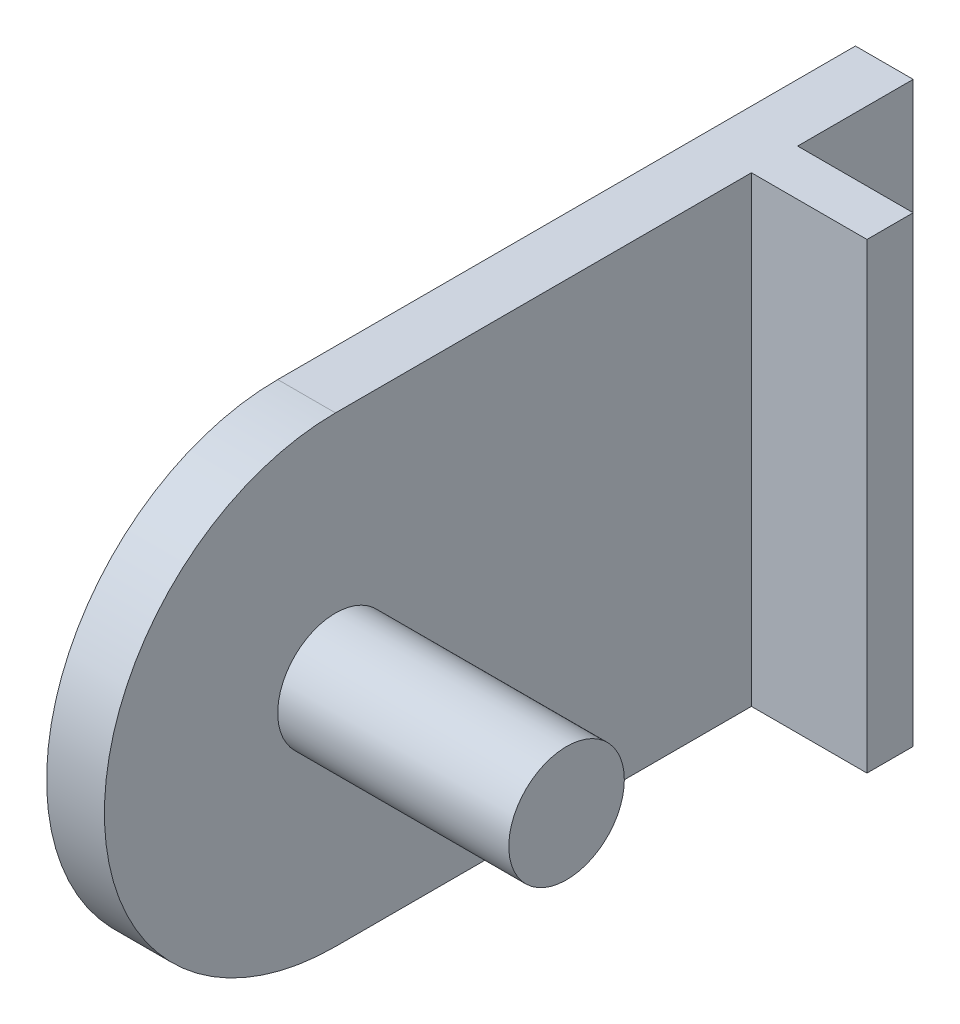
ISO-10303-21;
HEADER;
FILE_DESCRIPTION(('STEP AP214'),'2;1');
FILE_NAME('part.step','',(''),(''),'','','');
FILE_SCHEMA(('AUTOMOTIVE_DESIGN { 1 0 10303 214 1 1 1 1 }'));
ENDSEC;
DATA;
#1=APPLICATION_CONTEXT('core data for automotive mechanical design processes');
#2=APPLICATION_PROTOCOL_DEFINITION('international standard','automotive_design',2000,#1);
#3=PRODUCT_CONTEXT('',#1,'mechanical');
#4=PRODUCT('Part','Part','',(#3));
#5=PRODUCT_RELATED_PRODUCT_CATEGORY('part','',(#4));
#6=PRODUCT_DEFINITION_FORMATION('','',#4);
#7=PRODUCT_DEFINITION_CONTEXT('part definition',#1,'design');
#8=PRODUCT_DEFINITION('design','',#6,#7);
#9=PRODUCT_DEFINITION_SHAPE('','',#8);
#10=(LENGTH_UNIT() NAMED_UNIT(*) SI_UNIT(.MILLI.,.METRE.));
#11=(NAMED_UNIT(*) PLANE_ANGLE_UNIT() SI_UNIT($,.RADIAN.));
#12=(NAMED_UNIT(*) SI_UNIT($,.STERADIAN.) SOLID_ANGLE_UNIT());
#13=UNCERTAINTY_MEASURE_WITH_UNIT(LENGTH_MEASURE(1.E-05),#10,'distance_accuracy_value','');
#14=(GEOMETRIC_REPRESENTATION_CONTEXT(3) GLOBAL_UNCERTAINTY_ASSIGNED_CONTEXT((#13)) GLOBAL_UNIT_ASSIGNED_CONTEXT((#10,
#11,#12)) REPRESENTATION_CONTEXT('',''));
#15=CARTESIAN_POINT('',(0.,0.,0.));
#16=DIRECTION('',(0.,0.,1.));
#17=DIRECTION('',(1.,0.,0.));
#18=AXIS2_PLACEMENT_3D('',#15,#16,#17);
#19=CARTESIAN_POINT('',(5.,0.,0.));
#20=DIRECTION('',(1.,0.,0.));
#21=DIRECTION('',(0.,0.,-1.));
#22=AXIS2_PLACEMENT_3D('',#19,#20,#21);
#23=PLANE('',#22);
#24=CARTESIAN_POINT('',(5.,0.,0.));
#25=DIRECTION('',(1.,0.,0.));
#26=DIRECTION('',(0.,0.,-1.));
#27=AXIS2_PLACEMENT_3D('',#24,#25,#26);
#28=CIRCLE('',#27,5.);
#29=CARTESIAN_POINT('',(5.,0.,-5.));
#30=VERTEX_POINT('',#29);
#31=EDGE_CURVE('E132',#30,#30,#28,.T.);
#32=ORIENTED_EDGE('',*,*,#31,.F.);
#33=EDGE_LOOP('',(#32));
#34=FACE_BOUND('',#33,.T.);
#35=DIRECTION('',(0.,0.,-1.));
#36=VECTOR('',#35,1.);
#37=CARTESIAN_POINT('',(5.,-20.,0.));
#38=LINE('',#37,#36);
#39=CARTESIAN_POINT('',(5.,-20.,0.));
#40=VERTEX_POINT('',#39);
#41=CARTESIAN_POINT('',(5.,-20.,-36.));
#42=VERTEX_POINT('',#41);
#43=EDGE_CURVE('E145',#40,#42,#38,.T.);
#44=ORIENTED_EDGE('',*,*,#43,.T.);
#45=DIRECTION('',(0.,1.,0.));
#46=VECTOR('',#45,1.);
#47=CARTESIAN_POINT('',(5.,-20.,-36.));
#48=LINE('',#47,#46);
#49=CARTESIAN_POINT('',(5.,20.,-36.));
#50=VERTEX_POINT('',#49);
#51=EDGE_CURVE('E54',#42,#50,#48,.T.);
#52=ORIENTED_EDGE('',*,*,#51,.T.);
#53=DIRECTION('',(0.,0.,1.));
#54=VECTOR('',#53,1.);
#55=CARTESIAN_POINT('',(5.,20.,0.));
#56=LINE('',#55,#54);
#57=CARTESIAN_POINT('',(5.,20.,0.));
#58=VERTEX_POINT('',#57);
#59=EDGE_CURVE('E121',#50,#58,#56,.T.);
#60=ORIENTED_EDGE('',*,*,#59,.T.);
#61=CARTESIAN_POINT('',(5.,0.,0.));
#62=DIRECTION('',(1.,0.,0.));
#63=DIRECTION('',(0.,0.,-1.));
#64=AXIS2_PLACEMENT_3D('',#61,#62,#63);
#65=CIRCLE('',#64,20.);
#66=EDGE_CURVE('E152',#58,#40,#65,.T.);
#67=ORIENTED_EDGE('',*,*,#66,.T.);
#68=EDGE_LOOP('',(#44,#52,#60,#67));
#69=FACE_BOUND('',#68,.T.);
#70=ADVANCED_FACE('F39',(#34,#69),#23,.T.);
#71=CARTESIAN_POINT('',(5.,-20.,0.));
#72=DIRECTION('',(0.,1.,0.));
#73=DIRECTION('',(0.,0.,1.));
#74=AXIS2_PLACEMENT_3D('',#71,#72,#73);
#75=PLANE('',#74);
#76=DIRECTION('',(0.,0.,-1.));
#77=VECTOR('',#76,1.);
#78=CARTESIAN_POINT('',(0.,-20.,0.));
#79=LINE('',#78,#77);
#80=CARTESIAN_POINT('',(0.,-20.,0.));
#81=VERTEX_POINT('',#80);
#82=CARTESIAN_POINT('',(0.,-20.,-50.));
#83=VERTEX_POINT('',#82);
#84=EDGE_CURVE('E140',#81,#83,#79,.T.);
#85=ORIENTED_EDGE('',*,*,#84,.T.);
#86=DIRECTION('',(-1.,0.,0.));
#87=VECTOR('',#86,1.);
#88=CARTESIAN_POINT('',(5.,-20.,-50.));
#89=LINE('',#88,#87);
#90=CARTESIAN_POINT('',(5.,-20.,-50.));
#91=VERTEX_POINT('',#90);
#92=EDGE_CURVE('E11',#91,#83,#89,.T.);
#93=ORIENTED_EDGE('',*,*,#92,.F.);
#94=CARTESIAN_POINT('',(5.,-20.,-40.));
#95=VERTEX_POINT('',#94);
#96=EDGE_CURVE('E148',#95,#91,#38,.T.);
#97=ORIENTED_EDGE('',*,*,#96,.F.);
#98=DIRECTION('',(-1.,0.,0.));
#99=VECTOR('',#98,1.);
#100=CARTESIAN_POINT('',(15.,-20.,-40.));
#101=LINE('',#100,#99);
#102=CARTESIAN_POINT('',(15.,-20.,-40.));
#103=VERTEX_POINT('',#102);
#104=EDGE_CURVE('E141',#103,#95,#101,.T.);
#105=ORIENTED_EDGE('',*,*,#104,.F.);
#106=DIRECTION('',(0.,0.,1.));
#107=VECTOR('',#106,1.);
#108=CARTESIAN_POINT('',(15.,-20.,-40.));
#109=LINE('',#108,#107);
#110=CARTESIAN_POINT('',(15.,-20.,-36.));
#111=VERTEX_POINT('',#110);
#112=EDGE_CURVE('E124',#103,#111,#109,.T.);
#113=ORIENTED_EDGE('',*,*,#112,.T.);
#114=DIRECTION('',(-1.,0.,0.));
#115=VECTOR('',#114,1.);
#116=CARTESIAN_POINT('',(15.,-20.,-36.));
#117=LINE('',#116,#115);
#118=EDGE_CURVE('E128',#111,#42,#117,.T.);
#119=ORIENTED_EDGE('',*,*,#118,.T.);
#120=ORIENTED_EDGE('',*,*,#43,.F.);
#121=DIRECTION('',(-1.,0.,0.));
#122=VECTOR('',#121,1.);
#123=CARTESIAN_POINT('',(5.,-20.,0.));
#124=LINE('',#123,#122);
#125=EDGE_CURVE('E154',#40,#81,#124,.T.);
#126=ORIENTED_EDGE('',*,*,#125,.T.);
#127=EDGE_LOOP('',(#85,#93,#97,#105,#113,#119,#120,#126));
#128=FACE_BOUND('',#127,.T.);
#129=ADVANCED_FACE('F41',(#128),#75,.F.);
#130=CARTESIAN_POINT('',(5.,20.,-50.));
#131=DIRECTION('',(0.,0.,1.));
#132=DIRECTION('',(0.,-1.,0.));
#133=AXIS2_PLACEMENT_3D('',#130,#131,#132);
#134=PLANE('',#133);
#135=DIRECTION('',(0.,1.,0.));
#136=VECTOR('',#135,1.);
#137=CARTESIAN_POINT('',(0.,20.,-50.));
#138=LINE('',#137,#136);
#139=CARTESIAN_POINT('',(0.,20.,-50.));
#140=VERTEX_POINT('',#139);
#141=EDGE_CURVE('E157',#83,#140,#138,.T.);
#142=ORIENTED_EDGE('',*,*,#141,.T.);
#143=DIRECTION('',(-1.,0.,0.));
#144=VECTOR('',#143,1.);
#145=CARTESIAN_POINT('',(5.,20.,-50.));
#146=LINE('',#145,#144);
#147=CARTESIAN_POINT('',(5.,20.,-50.));
#148=VERTEX_POINT('',#147);
#149=EDGE_CURVE('E47',#148,#140,#146,.T.);
#150=ORIENTED_EDGE('',*,*,#149,.F.);
#151=DIRECTION('',(0.,1.,0.));
#152=VECTOR('',#151,1.);
#153=CARTESIAN_POINT('',(5.,20.,-50.));
#154=LINE('',#153,#152);
#155=EDGE_CURVE('E147',#91,#148,#154,.T.);
#156=ORIENTED_EDGE('',*,*,#155,.F.);
#157=ORIENTED_EDGE('',*,*,#92,.T.);
#158=EDGE_LOOP('',(#142,#150,#156,#157));
#159=FACE_BOUND('',#158,.T.);
#160=ADVANCED_FACE('F193',(#159),#134,.F.);
#161=CARTESIAN_POINT('',(5.,20.,0.));
#162=DIRECTION('',(0.,-1.,0.));
#163=DIRECTION('',(0.,0.,-1.));
#164=AXIS2_PLACEMENT_3D('',#161,#162,#163);
#165=PLANE('',#164);
#166=DIRECTION('',(0.,0.,1.));
#167=VECTOR('',#166,1.);
#168=CARTESIAN_POINT('',(0.,20.,0.));
#169=LINE('',#168,#167);
#170=CARTESIAN_POINT('',(0.,20.,0.));
#171=VERTEX_POINT('',#170);
#172=EDGE_CURVE('E159',#140,#171,#169,.T.);
#173=ORIENTED_EDGE('',*,*,#172,.T.);
#174=DIRECTION('',(-1.,0.,0.));
#175=VECTOR('',#174,1.);
#176=CARTESIAN_POINT('',(5.,20.,0.));
#177=LINE('',#176,#175);
#178=EDGE_CURVE('E165',#58,#171,#177,.T.);
#179=ORIENTED_EDGE('',*,*,#178,.F.);
#180=ORIENTED_EDGE('',*,*,#59,.F.);
#181=DIRECTION('',(-1.,0.,0.));
#182=VECTOR('',#181,1.);
#183=CARTESIAN_POINT('',(15.,20.,-36.));
#184=LINE('',#183,#182);
#185=CARTESIAN_POINT('',(15.,20.,-36.));
#186=VERTEX_POINT('',#185);
#187=EDGE_CURVE('E118',#186,#50,#184,.T.);
#188=ORIENTED_EDGE('',*,*,#187,.F.);
#189=DIRECTION('',(0.,0.,1.));
#190=VECTOR('',#189,1.);
#191=CARTESIAN_POINT('',(15.,20.,-40.));
#192=LINE('',#191,#190);
#193=CARTESIAN_POINT('',(15.,20.,-40.));
#194=VERTEX_POINT('',#193);
#195=EDGE_CURVE('E104',#194,#186,#192,.T.);
#196=ORIENTED_EDGE('',*,*,#195,.F.);
#197=DIRECTION('',(-1.,0.,0.));
#198=VECTOR('',#197,1.);
#199=CARTESIAN_POINT('',(15.,20.,-40.));
#200=LINE('',#199,#198);
#201=CARTESIAN_POINT('',(5.,20.,-40.));
#202=VERTEX_POINT('',#201);
#203=EDGE_CURVE('E123',#194,#202,#200,.T.);
#204=ORIENTED_EDGE('',*,*,#203,.T.);
#205=EDGE_CURVE('E150',#148,#202,#56,.T.);
#206=ORIENTED_EDGE('',*,*,#205,.F.);
#207=ORIENTED_EDGE('',*,*,#149,.T.);
#208=EDGE_LOOP('',(#173,#179,#180,#188,#196,#204,#206,#207));
#209=FACE_BOUND('',#208,.T.);
#210=ADVANCED_FACE('F119',(#209),#165,.F.);
#211=CARTESIAN_POINT('',(5.,0.,0.));
#212=DIRECTION('',(-1.,0.,0.));
#213=DIRECTION('',(0.,0.,1.));
#214=AXIS2_PLACEMENT_3D('',#211,#212,#213);
#215=CYLINDRICAL_SURFACE('',#214,20.);
#216=CARTESIAN_POINT('',(0.,0.,0.));
#217=DIRECTION('',(1.,0.,0.));
#218=DIRECTION('',(0.,0.,-1.));
#219=AXIS2_PLACEMENT_3D('',#216,#217,#218);
#220=CIRCLE('',#219,20.);
#221=EDGE_CURVE('E161',#171,#81,#220,.T.);
#222=ORIENTED_EDGE('',*,*,#221,.T.);
#223=ORIENTED_EDGE('',*,*,#125,.F.);
#224=ORIENTED_EDGE('',*,*,#66,.F.);
#225=ORIENTED_EDGE('',*,*,#178,.T.);
#226=EDGE_LOOP('',(#222,#223,#224,#225));
#227=FACE_BOUND('',#226,.T.);
#228=ADVANCED_FACE('F179',(#227),#215,.T.);
#229=DIRECTION('',(0.,1.,0.));
#230=VECTOR('',#229,1.);
#231=CARTESIAN_POINT('',(5.,-20.,-40.));
#232=LINE('',#231,#230);
#233=EDGE_CURVE('E62',#95,#202,#232,.T.);
#234=ORIENTED_EDGE('',*,*,#233,.F.);
#235=ORIENTED_EDGE('',*,*,#96,.T.);
#236=ORIENTED_EDGE('',*,*,#155,.T.);
#237=ORIENTED_EDGE('',*,*,#205,.T.);
#238=EDGE_LOOP('',(#234,#235,#236,#237));
#239=FACE_BOUND('',#238,.T.);
#240=ADVANCED_FACE('F187',(#239),#23,.T.);
#241=CARTESIAN_POINT('',(0.,0.,0.));
#242=DIRECTION('',(1.,0.,0.));
#243=DIRECTION('',(0.,0.,-1.));
#244=AXIS2_PLACEMENT_3D('',#241,#242,#243);
#245=PLANE('',#244);
#246=ORIENTED_EDGE('',*,*,#84,.F.);
#247=ORIENTED_EDGE('',*,*,#221,.F.);
#248=ORIENTED_EDGE('',*,*,#172,.F.);
#249=ORIENTED_EDGE('',*,*,#141,.F.);
#250=EDGE_LOOP('',(#246,#247,#248,#249));
#251=FACE_BOUND('',#250,.T.);
#252=ADVANCED_FACE('F176',(#251),#245,.F.);
#253=CARTESIAN_POINT('',(15.,-20.,-36.));
#254=DIRECTION('',(0.,0.,1.));
#255=DIRECTION('',(1.,0.,0.));
#256=AXIS2_PLACEMENT_3D('',#253,#254,#255);
#257=PLANE('',#256);
#258=ORIENTED_EDGE('',*,*,#51,.F.);
#259=ORIENTED_EDGE('',*,*,#118,.F.);
#260=DIRECTION('',(0.,1.,0.));
#261=VECTOR('',#260,1.);
#262=CARTESIAN_POINT('',(15.,-20.,-36.));
#263=LINE('',#262,#261);
#264=EDGE_CURVE('E109',#111,#186,#263,.T.);
#265=ORIENTED_EDGE('',*,*,#264,.T.);
#266=ORIENTED_EDGE('',*,*,#187,.T.);
#267=EDGE_LOOP('',(#258,#259,#265,#266));
#268=FACE_BOUND('',#267,.T.);
#269=ADVANCED_FACE('F126',(#268),#257,.T.);
#270=CARTESIAN_POINT('',(15.,-20.,-40.));
#271=DIRECTION('',(0.,0.,1.));
#272=DIRECTION('',(1.,0.,0.));
#273=AXIS2_PLACEMENT_3D('',#270,#271,#272);
#274=PLANE('',#273);
#275=ORIENTED_EDGE('',*,*,#233,.T.);
#276=ORIENTED_EDGE('',*,*,#203,.F.);
#277=DIRECTION('',(0.,1.,0.));
#278=VECTOR('',#277,1.);
#279=CARTESIAN_POINT('',(15.,-20.,-40.));
#280=LINE('',#279,#278);
#281=EDGE_CURVE('E112',#103,#194,#280,.T.);
#282=ORIENTED_EDGE('',*,*,#281,.F.);
#283=ORIENTED_EDGE('',*,*,#104,.T.);
#284=EDGE_LOOP('',(#275,#276,#282,#283));
#285=FACE_BOUND('',#284,.T.);
#286=ADVANCED_FACE('F212',(#285),#274,.F.);
#287=CARTESIAN_POINT('',(15.,0.,0.));
#288=DIRECTION('',(1.,0.,0.));
#289=DIRECTION('',(0.,0.,-1.));
#290=AXIS2_PLACEMENT_3D('',#287,#288,#289);
#291=PLANE('',#290);
#292=ORIENTED_EDGE('',*,*,#264,.F.);
#293=ORIENTED_EDGE('',*,*,#112,.F.);
#294=ORIENTED_EDGE('',*,*,#281,.T.);
#295=ORIENTED_EDGE('',*,*,#195,.T.);
#296=EDGE_LOOP('',(#292,#293,#294,#295));
#297=FACE_BOUND('',#296,.T.);
#298=ADVANCED_FACE('F106',(#297),#291,.T.);
#299=CARTESIAN_POINT('',(25.,0.,0.));
#300=DIRECTION('',(-1.,0.,0.));
#301=DIRECTION('',(0.,0.,1.));
#302=AXIS2_PLACEMENT_3D('',#299,#300,#301);
#303=CYLINDRICAL_SURFACE('',#302,5.);
#304=CARTESIAN_POINT('',(25.,0.,0.));
#305=DIRECTION('',(1.,0.,0.));
#306=DIRECTION('',(0.,0.,-1.));
#307=AXIS2_PLACEMENT_3D('',#304,#305,#306);
#308=CIRCLE('',#307,5.);
#309=CARTESIAN_POINT('',(25.,0.,-5.));
#310=VERTEX_POINT('',#309);
#311=EDGE_CURVE('E137',#310,#310,#308,.T.);
#312=ORIENTED_EDGE('',*,*,#311,.F.);
#313=EDGE_LOOP('',(#312));
#314=FACE_BOUND('',#313,.T.);
#315=ORIENTED_EDGE('',*,*,#31,.T.);
#316=EDGE_LOOP('',(#315));
#317=FACE_BOUND('',#316,.T.);
#318=ADVANCED_FACE('F217',(#314,#317),#303,.T.);
#319=CARTESIAN_POINT('',(25.,0.,0.));
#320=DIRECTION('',(1.,0.,0.));
#321=DIRECTION('',(0.,0.,-1.));
#322=AXIS2_PLACEMENT_3D('',#319,#320,#321);
#323=PLANE('',#322);
#324=ORIENTED_EDGE('',*,*,#311,.T.);
#325=EDGE_LOOP('',(#324));
#326=FACE_BOUND('',#325,.T.);
#327=ADVANCED_FACE('F221',(#326),#323,.T.);
#328=CLOSED_SHELL('',(#70,#129,#160,#210,#228,#240,#252,#269,#286,#298,#318,#327));
#329=MANIFOLD_SOLID_BREP('B2',#328);
#330=ADVANCED_BREP_SHAPE_REPRESENTATION('',(#18,#329),#14);
#331=SHAPE_DEFINITION_REPRESENTATION(#9,#330);
ENDSEC;
END-ISO-10303-21;
